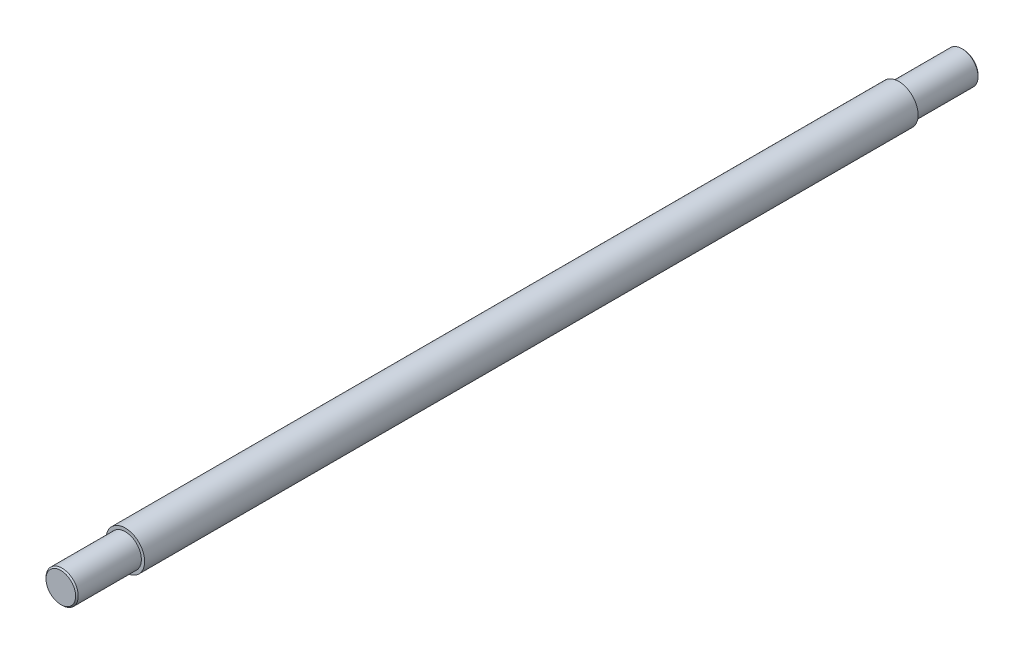
ISO-10303-21;
HEADER;
FILE_DESCRIPTION(('STEP AP214'),'2;1');
FILE_NAME('part.step','',(''),(''),'','','');
FILE_SCHEMA(('AUTOMOTIVE_DESIGN { 1 0 10303 214 1 1 1 1 }'));
ENDSEC;
DATA;
#1=APPLICATION_CONTEXT('core data for automotive mechanical design processes');
#2=APPLICATION_PROTOCOL_DEFINITION('international standard','automotive_design',2000,#1);
#3=PRODUCT_CONTEXT('',#1,'mechanical');
#4=PRODUCT('Part','Part','',(#3));
#5=PRODUCT_RELATED_PRODUCT_CATEGORY('part','',(#4));
#6=PRODUCT_DEFINITION_FORMATION('','',#4);
#7=PRODUCT_DEFINITION_CONTEXT('part definition',#1,'design');
#8=PRODUCT_DEFINITION('design','',#6,#7);
#9=PRODUCT_DEFINITION_SHAPE('','',#8);
#10=(LENGTH_UNIT() NAMED_UNIT(*) SI_UNIT(.MILLI.,.METRE.));
#11=(NAMED_UNIT(*) PLANE_ANGLE_UNIT() SI_UNIT($,.RADIAN.));
#12=(NAMED_UNIT(*) SI_UNIT($,.STERADIAN.) SOLID_ANGLE_UNIT());
#13=UNCERTAINTY_MEASURE_WITH_UNIT(LENGTH_MEASURE(1.E-05),#10,'distance_accuracy_value','');
#14=(GEOMETRIC_REPRESENTATION_CONTEXT(3) GLOBAL_UNCERTAINTY_ASSIGNED_CONTEXT((#13)) GLOBAL_UNIT_ASSIGNED_CONTEXT((#10,
#11,#12)) REPRESENTATION_CONTEXT('',''));
#15=CARTESIAN_POINT('',(0.,0.,0.));
#16=DIRECTION('',(0.,0.,1.));
#17=DIRECTION('',(1.,0.,0.));
#18=AXIS2_PLACEMENT_3D('',#15,#16,#17);
#19=CARTESIAN_POINT('',(0.,0.,69.8));
#20=DIRECTION('',(0.,0.,-1.));
#21=DIRECTION('',(-1.,0.,0.));
#22=AXIS2_PLACEMENT_3D('',#19,#20,#21);
#23=CONICAL_SURFACE('',#22,2.50000000000052,0.785398163400014);
#24=CARTESIAN_POINT('',(0.,0.,70.));
#25=DIRECTION('',(0.,0.,-1.));
#26=DIRECTION('',(-1.,0.,0.));
#27=AXIS2_PLACEMENT_3D('',#24,#25,#26);
#28=CIRCLE('',#27,2.29999999999948);
#29=CARTESIAN_POINT('',(-2.29999999999948,0.,70.));
#30=VERTEX_POINT('',#29);
#31=EDGE_CURVE('E78',#30,#30,#28,.T.);
#32=ORIENTED_EDGE('',*,*,#31,.T.);
#33=EDGE_LOOP('',(#32));
#34=FACE_BOUND('',#33,.T.);
#35=CARTESIAN_POINT('',(0.,0.,69.8));
#36=DIRECTION('',(0.,0.,-1.));
#37=DIRECTION('',(-1.,0.,0.));
#38=AXIS2_PLACEMENT_3D('',#35,#36,#37);
#39=CIRCLE('',#38,2.50000000000052);
#40=CARTESIAN_POINT('',(-2.50000000000052,0.,69.8));
#41=VERTEX_POINT('',#40);
#42=EDGE_CURVE('E10',#41,#41,#39,.T.);
#43=ORIENTED_EDGE('',*,*,#42,.F.);
#44=EDGE_LOOP('',(#43));
#45=FACE_BOUND('',#44,.T.);
#46=ADVANCED_FACE('F43',(#34,#45),#23,.T.);
#47=CARTESIAN_POINT('',(0.,0.,70.));
#48=DIRECTION('',(0.,0.,-1.));
#49=DIRECTION('',(-1.,0.,0.));
#50=AXIS2_PLACEMENT_3D('',#47,#48,#49);
#51=CYLINDRICAL_SURFACE('',#50,2.50000000000026);
#52=ORIENTED_EDGE('',*,*,#42,.T.);
#53=EDGE_LOOP('',(#52));
#54=FACE_BOUND('',#53,.T.);
#55=CARTESIAN_POINT('',(0.,0.,60.));
#56=DIRECTION('',(0.,0.,-1.));
#57=DIRECTION('',(-1.,0.,0.));
#58=AXIS2_PLACEMENT_3D('',#55,#56,#57);
#59=CIRCLE('',#58,2.5);
#60=CARTESIAN_POINT('',(-2.5,0.,60.));
#61=VERTEX_POINT('',#60);
#62=EDGE_CURVE('E50',#61,#61,#59,.T.);
#63=ORIENTED_EDGE('',*,*,#62,.F.);
#64=EDGE_LOOP('',(#63));
#65=FACE_BOUND('',#64,.T.);
#66=ADVANCED_FACE('F96',(#54,#65),#51,.T.);
#67=CARTESIAN_POINT('',(3.,0.,60.));
#68=DIRECTION('',(0.,0.,1.));
#69=DIRECTION('',(1.,0.,0.));
#70=AXIS2_PLACEMENT_3D('',#67,#68,#69);
#71=PLANE('',#70);
#72=ORIENTED_EDGE('',*,*,#62,.T.);
#73=EDGE_LOOP('',(#72));
#74=FACE_BOUND('',#73,.T.);
#75=CARTESIAN_POINT('',(0.,0.,60.));
#76=DIRECTION('',(0.,0.,-1.));
#77=DIRECTION('',(-1.,0.,0.));
#78=AXIS2_PLACEMENT_3D('',#75,#76,#77);
#79=CIRCLE('',#78,3.);
#80=CARTESIAN_POINT('',(-3.,0.,60.));
#81=VERTEX_POINT('',#80);
#82=EDGE_CURVE('E55',#81,#81,#79,.T.);
#83=ORIENTED_EDGE('',*,*,#82,.F.);
#84=EDGE_LOOP('',(#83));
#85=FACE_BOUND('',#84,.T.);
#86=ADVANCED_FACE('F100',(#74,#85),#71,.T.);
#87=CARTESIAN_POINT('',(0.,0.,70.));
#88=DIRECTION('',(0.,0.,-1.));
#89=DIRECTION('',(-1.,0.,0.));
#90=AXIS2_PLACEMENT_3D('',#87,#88,#89);
#91=CYLINDRICAL_SURFACE('',#90,3.);
#92=ORIENTED_EDGE('',*,*,#82,.T.);
#93=EDGE_LOOP('',(#92));
#94=FACE_BOUND('',#93,.T.);
#95=CARTESIAN_POINT('',(0.,0.,-60.));
#96=DIRECTION('',(0.,0.,-1.));
#97=DIRECTION('',(-1.,0.,0.));
#98=AXIS2_PLACEMENT_3D('',#95,#96,#97);
#99=CIRCLE('',#98,3.);
#100=CARTESIAN_POINT('',(-3.,0.,-60.));
#101=VERTEX_POINT('',#100);
#102=EDGE_CURVE('E60',#101,#101,#99,.T.);
#103=ORIENTED_EDGE('',*,*,#102,.F.);
#104=EDGE_LOOP('',(#103));
#105=FACE_BOUND('',#104,.T.);
#106=ADVANCED_FACE('F104',(#94,#105),#91,.T.);
#107=CARTESIAN_POINT('',(2.5,0.,-60.));
#108=DIRECTION('',(0.,0.,-1.));
#109=DIRECTION('',(-1.,0.,0.));
#110=AXIS2_PLACEMENT_3D('',#107,#108,#109);
#111=PLANE('',#110);
#112=ORIENTED_EDGE('',*,*,#102,.T.);
#113=EDGE_LOOP('',(#112));
#114=FACE_BOUND('',#113,.T.);
#115=CARTESIAN_POINT('',(0.,0.,-60.));
#116=DIRECTION('',(0.,0.,-1.));
#117=DIRECTION('',(-1.,0.,0.));
#118=AXIS2_PLACEMENT_3D('',#115,#116,#117);
#119=CIRCLE('',#118,2.5);
#120=CARTESIAN_POINT('',(-2.5,0.,-60.));
#121=VERTEX_POINT('',#120);
#122=EDGE_CURVE('E66',#121,#121,#119,.T.);
#123=ORIENTED_EDGE('',*,*,#122,.F.);
#124=EDGE_LOOP('',(#123));
#125=FACE_BOUND('',#124,.T.);
#126=ADVANCED_FACE('F110',(#114,#125),#111,.T.);
#127=CARTESIAN_POINT('',(0.,0.,70.));
#128=DIRECTION('',(0.,0.,-1.));
#129=DIRECTION('',(-1.,0.,0.));
#130=AXIS2_PLACEMENT_3D('',#127,#128,#129);
#131=CYLINDRICAL_SURFACE('',#130,2.5);
#132=ORIENTED_EDGE('',*,*,#122,.T.);
#133=EDGE_LOOP('',(#132));
#134=FACE_BOUND('',#133,.T.);
#135=CARTESIAN_POINT('',(0.,0.,-69.8));
#136=DIRECTION('',(0.,0.,-1.));
#137=DIRECTION('',(-1.,0.,0.));
#138=AXIS2_PLACEMENT_3D('',#135,#136,#137);
#139=CIRCLE('',#138,2.5);
#140=CARTESIAN_POINT('',(-2.5,0.,-69.8));
#141=VERTEX_POINT('',#140);
#142=EDGE_CURVE('E70',#141,#141,#139,.T.);
#143=ORIENTED_EDGE('',*,*,#142,.F.);
#144=EDGE_LOOP('',(#143));
#145=FACE_BOUND('',#144,.T.);
#146=ADVANCED_FACE('F114',(#134,#145),#131,.T.);
#147=CARTESIAN_POINT('',(0.,0.,-70.));
#148=DIRECTION('',(0.,0.,1.));
#149=DIRECTION('',(1.,0.,0.));
#150=AXIS2_PLACEMENT_3D('',#147,#148,#149);
#151=CONICAL_SURFACE('',#150,2.29999999999948,0.785398163398724);
#152=ORIENTED_EDGE('',*,*,#142,.T.);
#153=EDGE_LOOP('',(#152));
#154=FACE_BOUND('',#153,.T.);
#155=CARTESIAN_POINT('',(0.,0.,-70.));
#156=DIRECTION('',(0.,0.,-1.));
#157=DIRECTION('',(-1.,0.,0.));
#158=AXIS2_PLACEMENT_3D('',#155,#156,#157);
#159=CIRCLE('',#158,2.29999999999948);
#160=CARTESIAN_POINT('',(-2.29999999999948,0.,-70.));
#161=VERTEX_POINT('',#160);
#162=EDGE_CURVE('E74',#161,#161,#159,.T.);
#163=ORIENTED_EDGE('',*,*,#162,.F.);
#164=EDGE_LOOP('',(#163));
#165=FACE_BOUND('',#164,.T.);
#166=ADVANCED_FACE('F92',(#154,#165),#151,.T.);
#167=CARTESIAN_POINT('',(0.,0.,-70.));
#168=DIRECTION('',(0.,0.,-1.));
#169=DIRECTION('',(-1.,0.,0.));
#170=AXIS2_PLACEMENT_3D('',#167,#168,#169);
#171=PLANE('',#170);
#172=ORIENTED_EDGE('',*,*,#162,.T.);
#173=EDGE_LOOP('',(#172));
#174=FACE_BOUND('',#173,.T.);
#175=ADVANCED_FACE('F87',(#174),#171,.T.);
#176=CARTESIAN_POINT('',(2.29999999999948,0.,70.));
#177=DIRECTION('',(0.,0.,1.));
#178=DIRECTION('',(1.,0.,0.));
#179=AXIS2_PLACEMENT_3D('',#176,#177,#178);
#180=PLANE('',#179);
#181=ORIENTED_EDGE('',*,*,#31,.F.);
#182=EDGE_LOOP('',(#181));
#183=FACE_BOUND('',#182,.T.);
#184=ADVANCED_FACE('F85',(#183),#180,.T.);
#185=CLOSED_SHELL('',(#46,#66,#86,#106,#126,#146,#166,#175,#184));
#186=MANIFOLD_SOLID_BREP('B2',#185);
#187=ADVANCED_BREP_SHAPE_REPRESENTATION('',(#18,#186),#14);
#188=SHAPE_DEFINITION_REPRESENTATION(#9,#187);
ENDSEC;
END-ISO-10303-21;
